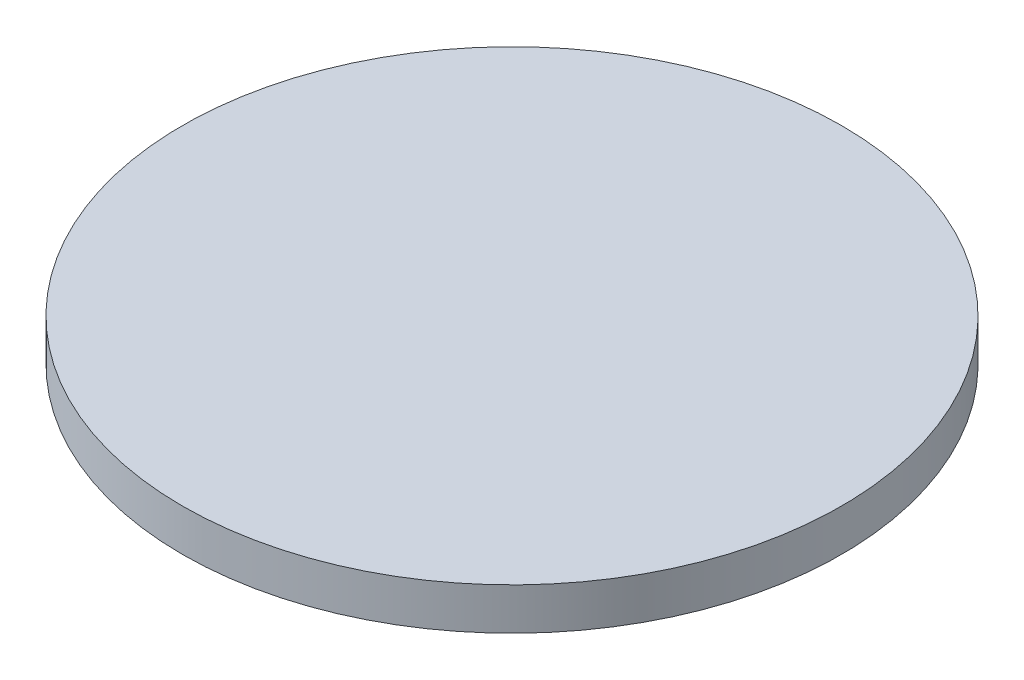
ISO-10303-21;
HEADER;
FILE_DESCRIPTION(('STEP AP214'),'2;1');
FILE_NAME('part.step','',(''),(''),'','','');
FILE_SCHEMA(('AUTOMOTIVE_DESIGN { 1 0 10303 214 1 1 1 1 }'));
ENDSEC;
DATA;
#1=APPLICATION_CONTEXT('core data for automotive mechanical design processes');
#2=APPLICATION_PROTOCOL_DEFINITION('international standard','automotive_design',2000,#1);
#3=PRODUCT_CONTEXT('',#1,'mechanical');
#4=PRODUCT('Part','Part','',(#3));
#5=PRODUCT_RELATED_PRODUCT_CATEGORY('part','',(#4));
#6=PRODUCT_DEFINITION_FORMATION('','',#4);
#7=PRODUCT_DEFINITION_CONTEXT('part definition',#1,'design');
#8=PRODUCT_DEFINITION('design','',#6,#7);
#9=PRODUCT_DEFINITION_SHAPE('','',#8);
#10=(LENGTH_UNIT() NAMED_UNIT(*) SI_UNIT(.MILLI.,.METRE.));
#11=(NAMED_UNIT(*) PLANE_ANGLE_UNIT() SI_UNIT($,.RADIAN.));
#12=(NAMED_UNIT(*) SI_UNIT($,.STERADIAN.) SOLID_ANGLE_UNIT());
#13=UNCERTAINTY_MEASURE_WITH_UNIT(LENGTH_MEASURE(1.E-05),#10,'distance_accuracy_value','');
#14=(GEOMETRIC_REPRESENTATION_CONTEXT(3) GLOBAL_UNCERTAINTY_ASSIGNED_CONTEXT((#13)) GLOBAL_UNIT_ASSIGNED_CONTEXT((#10,
#11,#12)) REPRESENTATION_CONTEXT('',''));
#15=CARTESIAN_POINT('',(0.,0.,0.));
#16=DIRECTION('',(0.,0.,1.));
#17=DIRECTION('',(1.,0.,0.));
#18=AXIS2_PLACEMENT_3D('',#15,#16,#17);
#19=CARTESIAN_POINT('',(0.,32.004,0.));
#20=DIRECTION('',(0.,1.,0.));
#21=DIRECTION('',(1.,0.,0.));
#22=AXIS2_PLACEMENT_3D('',#19,#20,#21);
#23=PLANE('',#22);
#24=CARTESIAN_POINT('',(0.,32.004,0.));
#25=DIRECTION('',(0.,1.,0.));
#26=DIRECTION('',(0.,0.,1.));
#27=AXIS2_PLACEMENT_3D('',#24,#25,#26);
#28=CIRCLE('',#27,4.3942);
#29=CARTESIAN_POINT('',(0.,32.004,4.3942));
#30=VERTEX_POINT('',#29);
#31=EDGE_CURVE('E23',#30,#30,#28,.T.);
#32=ORIENTED_EDGE('',*,*,#31,.F.);
#33=EDGE_LOOP('',(#32));
#34=FACE_BOUND('',#33,.T.);
#35=ADVANCED_FACE('F15',(#34),#23,.F.);
#36=CARTESIAN_POINT('',(0.,32.5628,0.));
#37=DIRECTION('',(0.,1.,0.));
#38=DIRECTION('',(0.,0.,-1.));
#39=AXIS2_PLACEMENT_3D('',#36,#37,#38);
#40=CYLINDRICAL_SURFACE('',#39,4.3942);
#41=ORIENTED_EDGE('',*,*,#31,.T.);
#42=EDGE_LOOP('',(#41));
#43=FACE_BOUND('',#42,.T.);
#44=CARTESIAN_POINT('',(0.,32.5628,0.));
#45=DIRECTION('',(0.,1.,0.));
#46=DIRECTION('',(0.,0.,1.));
#47=AXIS2_PLACEMENT_3D('',#44,#45,#46);
#48=CIRCLE('',#47,4.3942);
#49=CARTESIAN_POINT('',(0.,32.5628,4.3942));
#50=VERTEX_POINT('',#49);
#51=EDGE_CURVE('E10',#50,#50,#48,.T.);
#52=ORIENTED_EDGE('',*,*,#51,.F.);
#53=EDGE_LOOP('',(#52));
#54=FACE_BOUND('',#53,.T.);
#55=ADVANCED_FACE('F35',(#43,#54),#40,.T.);
#56=CARTESIAN_POINT('',(0.,32.5628,0.));
#57=DIRECTION('',(0.,1.,0.));
#58=DIRECTION('',(1.,0.,0.));
#59=AXIS2_PLACEMENT_3D('',#56,#57,#58);
#60=PLANE('',#59);
#61=ORIENTED_EDGE('',*,*,#51,.T.);
#62=EDGE_LOOP('',(#61));
#63=FACE_BOUND('',#62,.T.);
#64=ADVANCED_FACE('F17',(#63),#60,.T.);
#65=CLOSED_SHELL('',(#35,#55,#64));
#66=MANIFOLD_SOLID_BREP('B1',#65);
#67=ADVANCED_BREP_SHAPE_REPRESENTATION('',(#18,#66),#14);
#68=SHAPE_DEFINITION_REPRESENTATION(#9,#67);
ENDSEC;
END-ISO-10303-21;
